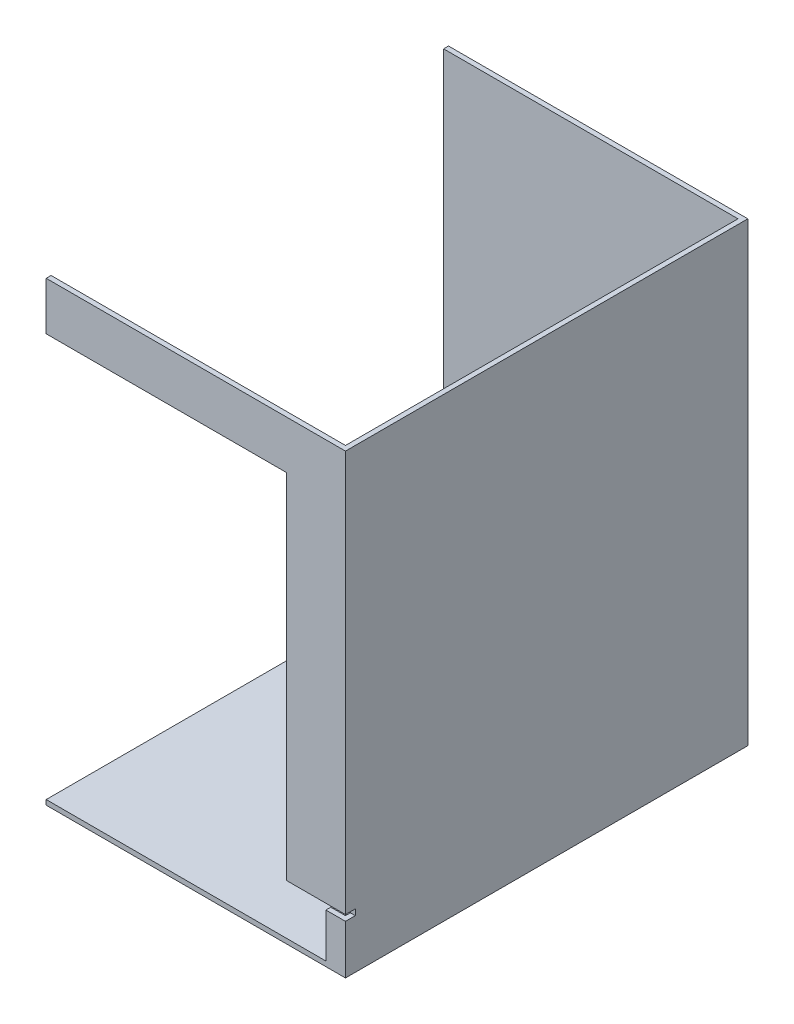
ISO-10303-21;
HEADER;
FILE_DESCRIPTION(('STEP AP214'),'2;1');
FILE_NAME('part.step','',(''),(''),'','','');
FILE_SCHEMA(('AUTOMOTIVE_DESIGN { 1 0 10303 214 1 1 1 1 }'));
ENDSEC;
DATA;
#1=APPLICATION_CONTEXT('core data for automotive mechanical design processes');
#2=APPLICATION_PROTOCOL_DEFINITION('international standard','automotive_design',2000,#1);
#3=PRODUCT_CONTEXT('',#1,'mechanical');
#4=PRODUCT('Part','Part','',(#3));
#5=PRODUCT_RELATED_PRODUCT_CATEGORY('part','',(#4));
#6=PRODUCT_DEFINITION_FORMATION('','',#4);
#7=PRODUCT_DEFINITION_CONTEXT('part definition',#1,'design');
#8=PRODUCT_DEFINITION('design','',#6,#7);
#9=PRODUCT_DEFINITION_SHAPE('','',#8);
#10=(LENGTH_UNIT() NAMED_UNIT(*) SI_UNIT(.MILLI.,.METRE.));
#11=(NAMED_UNIT(*) PLANE_ANGLE_UNIT() SI_UNIT($,.RADIAN.));
#12=(NAMED_UNIT(*) SI_UNIT($,.STERADIAN.) SOLID_ANGLE_UNIT());
#13=UNCERTAINTY_MEASURE_WITH_UNIT(LENGTH_MEASURE(1.E-05),#10,'distance_accuracy_value','');
#14=(GEOMETRIC_REPRESENTATION_CONTEXT(3) GLOBAL_UNCERTAINTY_ASSIGNED_CONTEXT((#13)) GLOBAL_UNIT_ASSIGNED_CONTEXT((#10,
#11,#12)) REPRESENTATION_CONTEXT('',''));
#15=CARTESIAN_POINT('',(0.,0.,0.));
#16=DIRECTION('',(0.,0.,1.));
#17=DIRECTION('',(1.,0.,0.));
#18=AXIS2_PLACEMENT_3D('',#15,#16,#17);
#19=CARTESIAN_POINT('',(202.189390083145,227.5,2.21219357111185));
#20=DIRECTION('',(-1.,0.,0.));
#21=DIRECTION('',(0.,0.,1.));
#22=AXIS2_PLACEMENT_3D('',#19,#20,#21);
#23=PLANE('',#22);
#24=DIRECTION('',(0.,-1.,0.));
#25=VECTOR('',#24,1.);
#26=CARTESIAN_POINT('',(202.189390083145,227.5,204.712193571112));
#27=LINE('',#26,#25);
#28=CARTESIAN_POINT('',(202.189390083145,-2.5,204.712193571112));
#29=VERTEX_POINT('',#28);
#30=CARTESIAN_POINT('',(202.189390083145,-5.,204.712193571112));
#31=VERTEX_POINT('',#30);
#32=EDGE_CURVE('E172',#29,#31,#27,.T.);
#33=ORIENTED_EDGE('',*,*,#32,.F.);
#34=DIRECTION('',(0.,0.,-1.));
#35=VECTOR('',#34,1.);
#36=CARTESIAN_POINT('',(202.189390083145,-2.5,2.21219357111185));
#37=LINE('',#36,#35);
#38=CARTESIAN_POINT('',(202.189390083145,-2.5,2.21219357111185));
#39=VERTEX_POINT('',#38);
#40=EDGE_CURVE('E155',#29,#39,#37,.T.);
#41=ORIENTED_EDGE('',*,*,#40,.T.);
#42=DIRECTION('',(0.,-1.,0.));
#43=VECTOR('',#42,1.);
#44=CARTESIAN_POINT('',(202.189390083145,227.5,2.21219357111185));
#45=LINE('',#44,#43);
#46=CARTESIAN_POINT('',(202.189390083145,227.5,2.21219357111185));
#47=VERTEX_POINT('',#46);
#48=EDGE_CURVE('E275',#47,#39,#45,.T.);
#49=ORIENTED_EDGE('',*,*,#48,.F.);
#50=DIRECTION('',(0.,0.,-1.));
#51=VECTOR('',#50,1.);
#52=CARTESIAN_POINT('',(202.189390083145,227.5,2.21219357111185));
#53=LINE('',#52,#51);
#54=CARTESIAN_POINT('',(202.189390083145,227.5,-0.287806428888147));
#55=VERTEX_POINT('',#54);
#56=EDGE_CURVE('E193',#47,#55,#53,.T.);
#57=ORIENTED_EDGE('',*,*,#56,.T.);
#58=DIRECTION('',(0.,-1.,0.));
#59=VECTOR('',#58,1.);
#60=CARTESIAN_POINT('',(202.189390083145,227.5,-0.287806428888147));
#61=LINE('',#60,#59);
#62=CARTESIAN_POINT('',(202.189390083145,-5.,-0.287806428888147));
#63=VERTEX_POINT('',#62);
#64=EDGE_CURVE('E183',#55,#63,#61,.T.);
#65=ORIENTED_EDGE('',*,*,#64,.T.);
#66=DIRECTION('',(0.,0.,-1.));
#67=VECTOR('',#66,1.);
#68=CARTESIAN_POINT('',(202.189390083145,-5.,0.));
#69=LINE('',#68,#67);
#70=EDGE_CURVE('E177',#31,#63,#69,.T.);
#71=ORIENTED_EDGE('',*,*,#70,.F.);
#72=EDGE_LOOP('',(#33,#41,#49,#57,#65,#71));
#73=FACE_BOUND('',#72,.T.);
#74=ADVANCED_FACE('F37',(#73),#23,.T.);
#75=CARTESIAN_POINT('',(352.189390083145,227.5,204.712193571112));
#76=DIRECTION('',(0.,0.,1.));
#77=DIRECTION('',(1.,0.,0.));
#78=AXIS2_PLACEMENT_3D('',#75,#76,#77);
#79=PLANE('',#78);
#80=DIRECTION('',(0.,1.,0.));
#81=VECTOR('',#80,1.);
#82=CARTESIAN_POINT('',(344.689390083145,20.,204.712193571112));
#83=LINE('',#82,#81);
#84=CARTESIAN_POINT('',(344.689390083145,-2.50000000000001,204.712193571112));
#85=VERTEX_POINT('',#84);
#86=CARTESIAN_POINT('',(344.689390083145,20.,204.712193571112));
#87=VERTEX_POINT('',#86);
#88=EDGE_CURVE('E52',#85,#87,#83,.T.);
#89=ORIENTED_EDGE('',*,*,#88,.F.);
#90=DIRECTION('',(1.,0.,0.));
#91=VECTOR('',#90,1.);
#92=CARTESIAN_POINT('',(344.689390083145,-2.50000000000001,204.712193571112));
#93=LINE('',#92,#91);
#94=EDGE_CURVE('E159',#29,#85,#93,.T.);
#95=ORIENTED_EDGE('',*,*,#94,.F.);
#96=ORIENTED_EDGE('',*,*,#32,.T.);
#97=DIRECTION('',(-1.,0.,0.));
#98=VECTOR('',#97,1.);
#99=CARTESIAN_POINT('',(0.,-5.,204.712193571112));
#100=LINE('',#99,#98);
#101=CARTESIAN_POINT('',(354.689390083145,-5.,204.712193571112));
#102=VERTEX_POINT('',#101);
#103=EDGE_CURVE('E288',#102,#31,#100,.T.);
#104=ORIENTED_EDGE('',*,*,#103,.F.);
#105=DIRECTION('',(0.,-1.,0.));
#106=VECTOR('',#105,1.);
#107=CARTESIAN_POINT('',(354.689390083145,227.5,204.712193571112));
#108=LINE('',#107,#106);
#109=CARTESIAN_POINT('',(354.689390083145,20.,204.712193571112));
#110=VERTEX_POINT('',#109);
#111=EDGE_CURVE('E185',#110,#102,#108,.T.);
#112=ORIENTED_EDGE('',*,*,#111,.F.);
#113=DIRECTION('',(1.,0.,0.));
#114=VECTOR('',#113,1.);
#115=CARTESIAN_POINT('',(354.689390083145,20.,204.712193571112));
#116=LINE('',#115,#114);
#117=EDGE_CURVE('E245',#87,#110,#116,.T.);
#118=ORIENTED_EDGE('',*,*,#117,.F.);
#119=EDGE_LOOP('',(#89,#95,#96,#104,#112,#118));
#120=FACE_BOUND('',#119,.T.);
#121=ADVANCED_FACE('F170',(#120),#79,.T.);
#122=CARTESIAN_POINT('',(352.189390083145,227.5,202.212193571112));
#123=DIRECTION('',(0.,0.,1.));
#124=DIRECTION('',(1.,0.,0.));
#125=AXIS2_PLACEMENT_3D('',#122,#123,#124);
#126=PLANE('',#125);
#127=DIRECTION('',(-1.,0.,0.));
#128=VECTOR('',#127,1.);
#129=CARTESIAN_POINT('',(352.189390083145,-2.5,202.212193571112));
#130=LINE('',#129,#128);
#131=CARTESIAN_POINT('',(352.189390083145,-2.5,202.212193571112));
#132=VERTEX_POINT('',#131);
#133=CARTESIAN_POINT('',(344.689390083145,-2.50000000000001,202.212193571112));
#134=VERTEX_POINT('',#133);
#135=EDGE_CURVE('E167',#132,#134,#130,.T.);
#136=ORIENTED_EDGE('',*,*,#135,.T.);
#137=DIRECTION('',(0.,1.,0.));
#138=VECTOR('',#137,1.);
#139=CARTESIAN_POINT('',(344.689390083145,227.5,202.212193571112));
#140=LINE('',#139,#138);
#141=CARTESIAN_POINT('',(344.689390083145,20.,202.212193571112));
#142=VERTEX_POINT('',#141);
#143=EDGE_CURVE('E240',#134,#142,#140,.T.);
#144=ORIENTED_EDGE('',*,*,#143,.T.);
#145=DIRECTION('',(1.,0.,0.));
#146=VECTOR('',#145,1.);
#147=CARTESIAN_POINT('',(352.189390083145,20.,202.212193571112));
#148=LINE('',#147,#146);
#149=CARTESIAN_POINT('',(352.189390083145,20.,202.212193571112));
#150=VERTEX_POINT('',#149);
#151=EDGE_CURVE('E205',#142,#150,#148,.T.);
#152=ORIENTED_EDGE('',*,*,#151,.T.);
#153=DIRECTION('',(0.,-1.,0.));
#154=VECTOR('',#153,1.);
#155=CARTESIAN_POINT('',(352.189390083145,227.5,202.212193571112));
#156=LINE('',#155,#154);
#157=EDGE_CURVE('E266',#150,#132,#156,.T.);
#158=ORIENTED_EDGE('',*,*,#157,.T.);
#159=EDGE_LOOP('',(#136,#144,#152,#158));
#160=FACE_BOUND('',#159,.T.);
#161=ADVANCED_FACE('F312',(#160),#126,.F.);
#162=DIRECTION('',(0.,0.,1.));
#163=VECTOR('',#162,1.);
#164=CARTESIAN_POINT('',(202.189390083145,203.,199.712193571112));
#165=LINE('',#164,#163);
#166=CARTESIAN_POINT('',(202.189390083145,203.,202.212193571112));
#167=VERTEX_POINT('',#166);
#168=CARTESIAN_POINT('',(202.189390083145,203.,204.712193571112));
#169=VERTEX_POINT('',#168);
#170=EDGE_CURVE('E248',#167,#169,#165,.T.);
#171=ORIENTED_EDGE('',*,*,#170,.T.);
#172=CARTESIAN_POINT('',(202.189390083145,227.5,204.712193571112));
#173=VERTEX_POINT('',#172);
#174=EDGE_CURVE('E179',#173,#169,#27,.T.);
#175=ORIENTED_EDGE('',*,*,#174,.F.);
#176=CARTESIAN_POINT('',(202.189390083145,227.5,202.212193571112));
#177=VERTEX_POINT('',#176);
#178=EDGE_CURVE('E282',#173,#177,#53,.T.);
#179=ORIENTED_EDGE('',*,*,#178,.T.);
#180=DIRECTION('',(0.,-1.,0.));
#181=VECTOR('',#180,1.);
#182=CARTESIAN_POINT('',(202.189390083145,227.5,202.212193571112));
#183=LINE('',#182,#181);
#184=EDGE_CURVE('E277',#177,#167,#183,.T.);
#185=ORIENTED_EDGE('',*,*,#184,.T.);
#186=EDGE_LOOP('',(#171,#175,#179,#185));
#187=FACE_BOUND('',#186,.T.);
#188=ADVANCED_FACE('F348',(#187),#23,.T.);
#189=CARTESIAN_POINT('',(354.689390083145,227.5,2.21219357111185));
#190=DIRECTION('',(1.,0.,0.));
#191=DIRECTION('',(0.,0.,-1.));
#192=AXIS2_PLACEMENT_3D('',#189,#190,#191);
#193=PLANE('',#192);
#194=DIRECTION('',(0.,0.,1.));
#195=VECTOR('',#194,1.);
#196=CARTESIAN_POINT('',(354.689390083145,20.,199.712193571112));
#197=LINE('',#196,#195);
#198=CARTESIAN_POINT('',(354.689390083145,20.,199.712193571112));
#199=VERTEX_POINT('',#198);
#200=EDGE_CURVE('E228',#199,#110,#197,.T.);
#201=ORIENTED_EDGE('',*,*,#200,.T.);
#202=ORIENTED_EDGE('',*,*,#111,.T.);
#203=DIRECTION('',(0.,0.,1.));
#204=VECTOR('',#203,1.);
#205=CARTESIAN_POINT('',(354.689390083145,-5.,0.));
#206=LINE('',#205,#204);
#207=CARTESIAN_POINT('',(354.689390083145,-5.,-0.287806428888147));
#208=VERTEX_POINT('',#207);
#209=EDGE_CURVE('E274',#208,#102,#206,.T.);
#210=ORIENTED_EDGE('',*,*,#209,.F.);
#211=DIRECTION('',(0.,-1.,0.));
#212=VECTOR('',#211,1.);
#213=CARTESIAN_POINT('',(354.689390083145,227.5,-0.287806428888147));
#214=LINE('',#213,#212);
#215=CARTESIAN_POINT('',(354.689390083145,227.5,-0.287806428888147));
#216=VERTEX_POINT('',#215);
#217=EDGE_CURVE('E199',#216,#208,#214,.T.);
#218=ORIENTED_EDGE('',*,*,#217,.F.);
#219=DIRECTION('',(0.,0.,1.));
#220=VECTOR('',#219,1.);
#221=CARTESIAN_POINT('',(354.689390083145,227.5,0.));
#222=LINE('',#221,#220);
#223=CARTESIAN_POINT('',(354.689390083145,227.5,204.712193571112));
#224=VERTEX_POINT('',#223);
#225=EDGE_CURVE('E194',#216,#224,#222,.T.);
#226=ORIENTED_EDGE('',*,*,#225,.T.);
#227=CARTESIAN_POINT('',(354.689390083145,23.,204.712193571112));
#228=VERTEX_POINT('',#227);
#229=EDGE_CURVE('E180',#224,#228,#108,.T.);
#230=ORIENTED_EDGE('',*,*,#229,.T.);
#231=DIRECTION('',(0.,0.,1.));
#232=VECTOR('',#231,1.);
#233=CARTESIAN_POINT('',(354.689390083145,23.,199.712193571112));
#234=LINE('',#233,#232);
#235=CARTESIAN_POINT('',(354.689390083145,23.,199.712193571112));
#236=VERTEX_POINT('',#235);
#237=EDGE_CURVE('E230',#236,#228,#234,.T.);
#238=ORIENTED_EDGE('',*,*,#237,.F.);
#239=DIRECTION('',(0.,1.,0.));
#240=VECTOR('',#239,1.);
#241=CARTESIAN_POINT('',(354.689390083145,23.,199.712193571112));
#242=LINE('',#241,#240);
#243=EDGE_CURVE('E233',#199,#236,#242,.T.);
#244=ORIENTED_EDGE('',*,*,#243,.F.);
#245=EDGE_LOOP('',(#201,#202,#210,#218,#226,#230,#238,#244));
#246=FACE_BOUND('',#245,.T.);
#247=ADVANCED_FACE('F307',(#246),#193,.T.);
#248=CARTESIAN_POINT('',(352.189390083145,227.5,-0.287806428888147));
#249=DIRECTION('',(0.,0.,-1.));
#250=DIRECTION('',(-1.,0.,0.));
#251=AXIS2_PLACEMENT_3D('',#248,#249,#250);
#252=PLANE('',#251);
#253=DIRECTION('',(1.,0.,0.));
#254=VECTOR('',#253,1.);
#255=CARTESIAN_POINT('',(0.,-5.,-0.287806428888147));
#256=LINE('',#255,#254);
#257=EDGE_CURVE('E290',#63,#208,#256,.T.);
#258=ORIENTED_EDGE('',*,*,#257,.F.);
#259=ORIENTED_EDGE('',*,*,#64,.F.);
#260=DIRECTION('',(1.,0.,0.));
#261=VECTOR('',#260,1.);
#262=CARTESIAN_POINT('',(0.,227.5,-0.287806428888147));
#263=LINE('',#262,#261);
#264=EDGE_CURVE('E285',#55,#216,#263,.T.);
#265=ORIENTED_EDGE('',*,*,#264,.T.);
#266=ORIENTED_EDGE('',*,*,#217,.T.);
#267=EDGE_LOOP('',(#258,#259,#265,#266));
#268=FACE_BOUND('',#267,.T.);
#269=ADVANCED_FACE('F303',(#268),#252,.T.);
#270=DIRECTION('',(-1.,0.,0.));
#271=VECTOR('',#270,1.);
#272=CARTESIAN_POINT('',(202.189390083145,203.,204.712193571112));
#273=LINE('',#272,#271);
#274=CARTESIAN_POINT('',(324.689390083145,203.,204.712193571112));
#275=VERTEX_POINT('',#274);
#276=EDGE_CURVE('E243',#275,#169,#273,.T.);
#277=ORIENTED_EDGE('',*,*,#276,.F.);
#278=DIRECTION('',(0.,1.,0.));
#279=VECTOR('',#278,1.);
#280=CARTESIAN_POINT('',(324.689390083145,203.,204.712193571112));
#281=LINE('',#280,#279);
#282=CARTESIAN_POINT('',(324.689390083145,23.,204.712193571112));
#283=VERTEX_POINT('',#282);
#284=EDGE_CURVE('E239',#283,#275,#281,.T.);
#285=ORIENTED_EDGE('',*,*,#284,.F.);
#286=DIRECTION('',(-1.,0.,0.));
#287=VECTOR('',#286,1.);
#288=CARTESIAN_POINT('',(354.689390083145,23.,204.712193571112));
#289=LINE('',#288,#287);
#290=EDGE_CURVE('E237',#228,#283,#289,.T.);
#291=ORIENTED_EDGE('',*,*,#290,.F.);
#292=ORIENTED_EDGE('',*,*,#229,.F.);
#293=DIRECTION('',(-1.,0.,0.));
#294=VECTOR('',#293,1.);
#295=CARTESIAN_POINT('',(0.,227.5,204.712193571112));
#296=LINE('',#295,#294);
#297=EDGE_CURVE('E190',#224,#173,#296,.T.);
#298=ORIENTED_EDGE('',*,*,#297,.T.);
#299=ORIENTED_EDGE('',*,*,#174,.T.);
#300=EDGE_LOOP('',(#277,#285,#291,#292,#298,#299));
#301=FACE_BOUND('',#300,.T.);
#302=ADVANCED_FACE('F324',(#301),#79,.T.);
#303=CARTESIAN_POINT('',(0.,227.5,0.));
#304=DIRECTION('',(0.,-1.,0.));
#305=DIRECTION('',(0.,0.,-1.));
#306=AXIS2_PLACEMENT_3D('',#303,#304,#305);
#307=PLANE('',#306);
#308=ORIENTED_EDGE('',*,*,#56,.F.);
#309=DIRECTION('',(1.,0.,0.));
#310=VECTOR('',#309,1.);
#311=CARTESIAN_POINT('',(352.189390083145,227.5,2.21219357111185));
#312=LINE('',#311,#310);
#313=CARTESIAN_POINT('',(352.189390083145,227.5,2.21219357111185));
#314=VERTEX_POINT('',#313);
#315=EDGE_CURVE('E263',#47,#314,#312,.T.);
#316=ORIENTED_EDGE('',*,*,#315,.T.);
#317=DIRECTION('',(0.,0.,1.));
#318=VECTOR('',#317,1.);
#319=CARTESIAN_POINT('',(352.189390083145,227.5,2.21219357111185));
#320=LINE('',#319,#318);
#321=CARTESIAN_POINT('',(352.189390083145,227.5,202.212193571112));
#322=VERTEX_POINT('',#321);
#323=EDGE_CURVE('E257',#314,#322,#320,.T.);
#324=ORIENTED_EDGE('',*,*,#323,.T.);
#325=DIRECTION('',(-1.,0.,0.));
#326=VECTOR('',#325,1.);
#327=CARTESIAN_POINT('',(352.189390083145,227.5,202.212193571112));
#328=LINE('',#327,#326);
#329=EDGE_CURVE('E260',#322,#177,#328,.T.);
#330=ORIENTED_EDGE('',*,*,#329,.T.);
#331=ORIENTED_EDGE('',*,*,#178,.F.);
#332=ORIENTED_EDGE('',*,*,#297,.F.);
#333=ORIENTED_EDGE('',*,*,#225,.F.);
#334=ORIENTED_EDGE('',*,*,#264,.F.);
#335=EDGE_LOOP('',(#308,#316,#324,#330,#331,#332,#333,#334));
#336=FACE_BOUND('',#335,.T.);
#337=ADVANCED_FACE('F334',(#336),#307,.F.);
#338=CARTESIAN_POINT('',(0.,-5.,0.));
#339=DIRECTION('',(0.,-1.,0.));
#340=DIRECTION('',(0.,0.,-1.));
#341=AXIS2_PLACEMENT_3D('',#338,#339,#340);
#342=PLANE('',#341);
#343=ORIENTED_EDGE('',*,*,#209,.T.);
#344=ORIENTED_EDGE('',*,*,#103,.T.);
#345=ORIENTED_EDGE('',*,*,#70,.T.);
#346=ORIENTED_EDGE('',*,*,#257,.T.);
#347=EDGE_LOOP('',(#343,#344,#345,#346));
#348=FACE_BOUND('',#347,.T.);
#349=ADVANCED_FACE('F39',(#348),#342,.T.);
#350=CARTESIAN_POINT('',(352.189390083145,227.5,2.21219357111185));
#351=DIRECTION('',(1.,0.,0.));
#352=DIRECTION('',(0.,0.,-1.));
#353=AXIS2_PLACEMENT_3D('',#350,#351,#352);
#354=PLANE('',#353);
#355=ORIENTED_EDGE('',*,*,#157,.F.);
#356=DIRECTION('',(0.,0.,-1.));
#357=VECTOR('',#356,1.);
#358=CARTESIAN_POINT('',(352.189390083145,20.,2.21219357111185));
#359=LINE('',#358,#357);
#360=CARTESIAN_POINT('',(352.189390083145,20.,199.712193571112));
#361=VERTEX_POINT('',#360);
#362=EDGE_CURVE('E215',#150,#361,#359,.T.);
#363=ORIENTED_EDGE('',*,*,#362,.T.);
#364=DIRECTION('',(0.,1.,0.));
#365=VECTOR('',#364,1.);
#366=CARTESIAN_POINT('',(352.189390083145,227.5,199.712193571112));
#367=LINE('',#366,#365);
#368=CARTESIAN_POINT('',(352.189390083145,23.,199.712193571112));
#369=VERTEX_POINT('',#368);
#370=EDGE_CURVE('E45',#361,#369,#367,.T.);
#371=ORIENTED_EDGE('',*,*,#370,.T.);
#372=DIRECTION('',(0.,0.,1.));
#373=VECTOR('',#372,1.);
#374=CARTESIAN_POINT('',(352.189390083145,23.,2.21219357111185));
#375=LINE('',#374,#373);
#376=CARTESIAN_POINT('',(352.189390083145,23.,202.212193571112));
#377=VERTEX_POINT('',#376);
#378=EDGE_CURVE('E212',#369,#377,#375,.T.);
#379=ORIENTED_EDGE('',*,*,#378,.T.);
#380=EDGE_CURVE('E280',#322,#377,#156,.T.);
#381=ORIENTED_EDGE('',*,*,#380,.F.);
#382=ORIENTED_EDGE('',*,*,#323,.F.);
#383=DIRECTION('',(0.,-1.,0.));
#384=VECTOR('',#383,1.);
#385=CARTESIAN_POINT('',(352.189390083145,227.5,2.21219357111185));
#386=LINE('',#385,#384);
#387=CARTESIAN_POINT('',(352.189390083145,-2.5,2.21219357111185));
#388=VERTEX_POINT('',#387);
#389=EDGE_CURVE('E272',#314,#388,#386,.T.);
#390=ORIENTED_EDGE('',*,*,#389,.T.);
#391=DIRECTION('',(0.,0.,1.));
#392=VECTOR('',#391,1.);
#393=CARTESIAN_POINT('',(352.189390083145,-2.5,2.21219357111185));
#394=LINE('',#393,#392);
#395=EDGE_CURVE('E256',#388,#132,#394,.T.);
#396=ORIENTED_EDGE('',*,*,#395,.T.);
#397=EDGE_LOOP('',(#355,#363,#371,#379,#381,#382,#390,#396));
#398=FACE_BOUND('',#397,.T.);
#399=ADVANCED_FACE('F211',(#398),#354,.F.);
#400=CARTESIAN_POINT('',(352.189390083145,227.5,2.21219357111185));
#401=DIRECTION('',(0.,0.,-1.));
#402=DIRECTION('',(-1.,0.,0.));
#403=AXIS2_PLACEMENT_3D('',#400,#401,#402);
#404=PLANE('',#403);
#405=DIRECTION('',(1.,0.,0.));
#406=VECTOR('',#405,1.);
#407=CARTESIAN_POINT('',(352.189390083145,-2.5,2.21219357111185));
#408=LINE('',#407,#406);
#409=EDGE_CURVE('E162',#39,#388,#408,.T.);
#410=ORIENTED_EDGE('',*,*,#409,.T.);
#411=ORIENTED_EDGE('',*,*,#389,.F.);
#412=ORIENTED_EDGE('',*,*,#315,.F.);
#413=ORIENTED_EDGE('',*,*,#48,.T.);
#414=EDGE_LOOP('',(#410,#411,#412,#413));
#415=FACE_BOUND('',#414,.T.);
#416=ADVANCED_FACE('F336',(#415),#404,.F.);
#417=DIRECTION('',(0.,1.,0.));
#418=VECTOR('',#417,1.);
#419=CARTESIAN_POINT('',(324.689390083145,227.5,202.212193571112));
#420=LINE('',#419,#418);
#421=CARTESIAN_POINT('',(324.689390083145,23.,202.212193571112));
#422=VERTEX_POINT('',#421);
#423=CARTESIAN_POINT('',(324.689390083145,203.,202.212193571112));
#424=VERTEX_POINT('',#423);
#425=EDGE_CURVE('E198',#422,#424,#420,.T.);
#426=ORIENTED_EDGE('',*,*,#425,.T.);
#427=DIRECTION('',(-1.,0.,0.));
#428=VECTOR('',#427,1.);
#429=CARTESIAN_POINT('',(352.189390083145,203.,202.212193571112));
#430=LINE('',#429,#428);
#431=EDGE_CURVE('E202',#424,#167,#430,.T.);
#432=ORIENTED_EDGE('',*,*,#431,.T.);
#433=ORIENTED_EDGE('',*,*,#184,.F.);
#434=ORIENTED_EDGE('',*,*,#329,.F.);
#435=ORIENTED_EDGE('',*,*,#380,.T.);
#436=DIRECTION('',(-1.,0.,0.));
#437=VECTOR('',#436,1.);
#438=CARTESIAN_POINT('',(352.189390083145,23.,202.212193571112));
#439=LINE('',#438,#437);
#440=EDGE_CURVE('E195',#377,#422,#439,.T.);
#441=ORIENTED_EDGE('',*,*,#440,.T.);
#442=EDGE_LOOP('',(#426,#432,#433,#434,#435,#441));
#443=FACE_BOUND('',#442,.T.);
#444=ADVANCED_FACE('F330',(#443),#126,.F.);
#445=CARTESIAN_POINT('',(0.,-2.5,0.));
#446=DIRECTION('',(0.,-1.,0.));
#447=DIRECTION('',(0.,0.,-1.));
#448=AXIS2_PLACEMENT_3D('',#445,#446,#447);
#449=PLANE('',#448);
#450=ORIENTED_EDGE('',*,*,#40,.F.);
#451=ORIENTED_EDGE('',*,*,#94,.T.);
#452=DIRECTION('',(0.,0.,1.));
#453=VECTOR('',#452,1.);
#454=CARTESIAN_POINT('',(344.689390083145,-2.50000000000001,199.712193571112));
#455=LINE('',#454,#453);
#456=EDGE_CURVE('E314',#134,#85,#455,.T.);
#457=ORIENTED_EDGE('',*,*,#456,.F.);
#458=ORIENTED_EDGE('',*,*,#135,.F.);
#459=ORIENTED_EDGE('',*,*,#395,.F.);
#460=ORIENTED_EDGE('',*,*,#409,.F.);
#461=EDGE_LOOP('',(#450,#451,#457,#458,#459,#460));
#462=FACE_BOUND('',#461,.T.);
#463=ADVANCED_FACE('F157',(#462),#449,.F.);
#464=CARTESIAN_POINT('',(0.,0.,199.712193571112));
#465=DIRECTION('',(0.,0.,-1.));
#466=DIRECTION('',(-1.,0.,0.));
#467=AXIS2_PLACEMENT_3D('',#464,#465,#466);
#468=PLANE('',#467);
#469=DIRECTION('',(1.,0.,0.));
#470=VECTOR('',#469,1.);
#471=CARTESIAN_POINT('',(354.689390083145,20.,199.712193571112));
#472=LINE('',#471,#470);
#473=EDGE_CURVE('E221',#361,#199,#472,.T.);
#474=ORIENTED_EDGE('',*,*,#473,.T.);
#475=ORIENTED_EDGE('',*,*,#243,.T.);
#476=DIRECTION('',(-1.,0.,0.));
#477=VECTOR('',#476,1.);
#478=CARTESIAN_POINT('',(354.689390083145,23.,199.712193571112));
#479=LINE('',#478,#477);
#480=EDGE_CURVE('E223',#236,#369,#479,.T.);
#481=ORIENTED_EDGE('',*,*,#480,.T.);
#482=ORIENTED_EDGE('',*,*,#370,.F.);
#483=EDGE_LOOP('',(#474,#475,#481,#482));
#484=FACE_BOUND('',#483,.T.);
#485=ADVANCED_FACE('F219',(#484),#468,.F.);
#486=CARTESIAN_POINT('',(354.689390083145,20.,199.712193571112));
#487=DIRECTION('',(0.,-1.,0.));
#488=DIRECTION('',(1.,0.,0.));
#489=AXIS2_PLACEMENT_3D('',#486,#487,#488);
#490=PLANE('',#489);
#491=ORIENTED_EDGE('',*,*,#151,.F.);
#492=DIRECTION('',(0.,0.,1.));
#493=VECTOR('',#492,1.);
#494=CARTESIAN_POINT('',(344.689390083145,20.,199.712193571112));
#495=LINE('',#494,#493);
#496=EDGE_CURVE('E11',#142,#87,#495,.T.);
#497=ORIENTED_EDGE('',*,*,#496,.T.);
#498=ORIENTED_EDGE('',*,*,#117,.T.);
#499=ORIENTED_EDGE('',*,*,#200,.F.);
#500=ORIENTED_EDGE('',*,*,#473,.F.);
#501=ORIENTED_EDGE('',*,*,#362,.F.);
#502=EDGE_LOOP('',(#491,#497,#498,#499,#500,#501));
#503=FACE_BOUND('',#502,.T.);
#504=ADVANCED_FACE('F226',(#503),#490,.F.);
#505=CARTESIAN_POINT('',(202.189390083145,203.,199.712193571112));
#506=DIRECTION('',(0.,1.,0.));
#507=DIRECTION('',(0.,0.,1.));
#508=AXIS2_PLACEMENT_3D('',#505,#506,#507);
#509=PLANE('',#508);
#510=DIRECTION('',(0.,0.,1.));
#511=VECTOR('',#510,1.);
#512=CARTESIAN_POINT('',(324.689390083145,203.,199.712193571112));
#513=LINE('',#512,#511);
#514=EDGE_CURVE('E251',#424,#275,#513,.T.);
#515=ORIENTED_EDGE('',*,*,#514,.T.);
#516=ORIENTED_EDGE('',*,*,#276,.T.);
#517=ORIENTED_EDGE('',*,*,#170,.F.);
#518=ORIENTED_EDGE('',*,*,#431,.F.);
#519=EDGE_LOOP('',(#515,#516,#517,#518));
#520=FACE_BOUND('',#519,.T.);
#521=ADVANCED_FACE('F362',(#520),#509,.F.);
#522=CARTESIAN_POINT('',(324.689390083145,203.,199.712193571112));
#523=DIRECTION('',(1.,0.,0.));
#524=DIRECTION('',(0.,0.,-1.));
#525=AXIS2_PLACEMENT_3D('',#522,#523,#524);
#526=PLANE('',#525);
#527=DIRECTION('',(0.,0.,1.));
#528=VECTOR('',#527,1.);
#529=CARTESIAN_POINT('',(324.689390083145,23.,199.712193571112));
#530=LINE('',#529,#528);
#531=EDGE_CURVE('E59',#422,#283,#530,.T.);
#532=ORIENTED_EDGE('',*,*,#531,.T.);
#533=ORIENTED_EDGE('',*,*,#284,.T.);
#534=ORIENTED_EDGE('',*,*,#514,.F.);
#535=ORIENTED_EDGE('',*,*,#425,.F.);
#536=EDGE_LOOP('',(#532,#533,#534,#535));
#537=FACE_BOUND('',#536,.T.);
#538=ADVANCED_FACE('F328',(#537),#526,.F.);
#539=CARTESIAN_POINT('',(354.689390083145,23.,199.712193571112));
#540=DIRECTION('',(0.,1.,0.));
#541=DIRECTION('',(-1.,0.,0.));
#542=AXIS2_PLACEMENT_3D('',#539,#540,#541);
#543=PLANE('',#542);
#544=ORIENTED_EDGE('',*,*,#480,.F.);
#545=ORIENTED_EDGE('',*,*,#237,.T.);
#546=ORIENTED_EDGE('',*,*,#290,.T.);
#547=ORIENTED_EDGE('',*,*,#531,.F.);
#548=ORIENTED_EDGE('',*,*,#440,.F.);
#549=ORIENTED_EDGE('',*,*,#378,.F.);
#550=EDGE_LOOP('',(#544,#545,#546,#547,#548,#549));
#551=FACE_BOUND('',#550,.T.);
#552=ADVANCED_FACE('F320',(#551),#543,.F.);
#553=CARTESIAN_POINT('',(344.689390083145,20.,199.712193571112));
#554=DIRECTION('',(1.,0.,0.));
#555=DIRECTION('',(0.,0.,-1.));
#556=AXIS2_PLACEMENT_3D('',#553,#554,#555);
#557=PLANE('',#556);
#558=ORIENTED_EDGE('',*,*,#456,.T.);
#559=ORIENTED_EDGE('',*,*,#88,.T.);
#560=ORIENTED_EDGE('',*,*,#496,.F.);
#561=ORIENTED_EDGE('',*,*,#143,.F.);
#562=EDGE_LOOP('',(#558,#559,#560,#561));
#563=FACE_BOUND('',#562,.T.);
#564=ADVANCED_FACE('F310',(#563),#557,.F.);
#565=CLOSED_SHELL('',(#74,#121,#161,#188,#247,#269,#302,#337,#349,#399,#416,#444,#463,#485,#504,
#521,#538,#552,#564));
#566=MANIFOLD_SOLID_BREP('B2',#565);
#567=ADVANCED_BREP_SHAPE_REPRESENTATION('',(#18,#566),#14);
#568=SHAPE_DEFINITION_REPRESENTATION(#9,#567);
ENDSEC;
END-ISO-10303-21;
